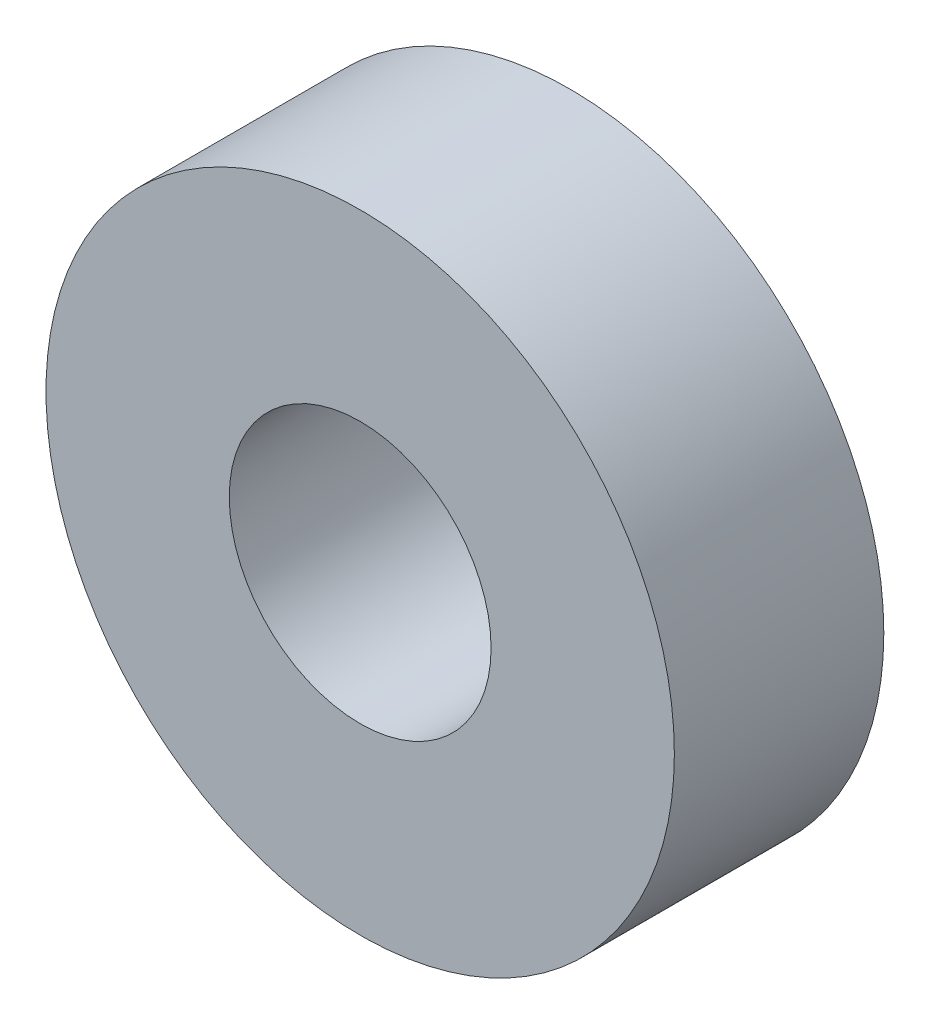
ISO-10303-21;
HEADER;
FILE_DESCRIPTION(('STEP AP214'),'2;1');
FILE_NAME('part.step','',(''),(''),'','','');
FILE_SCHEMA(('AUTOMOTIVE_DESIGN { 1 0 10303 214 1 1 1 1 }'));
ENDSEC;
DATA;
#1=APPLICATION_CONTEXT('core data for automotive mechanical design processes');
#2=APPLICATION_PROTOCOL_DEFINITION('international standard','automotive_design',2000,#1);
#3=PRODUCT_CONTEXT('',#1,'mechanical');
#4=PRODUCT('Part','Part','',(#3));
#5=PRODUCT_RELATED_PRODUCT_CATEGORY('part','',(#4));
#6=PRODUCT_DEFINITION_FORMATION('','',#4);
#7=PRODUCT_DEFINITION_CONTEXT('part definition',#1,'design');
#8=PRODUCT_DEFINITION('design','',#6,#7);
#9=PRODUCT_DEFINITION_SHAPE('','',#8);
#10=(LENGTH_UNIT() NAMED_UNIT(*) SI_UNIT(.MILLI.,.METRE.));
#11=(NAMED_UNIT(*) PLANE_ANGLE_UNIT() SI_UNIT($,.RADIAN.));
#12=(NAMED_UNIT(*) SI_UNIT($,.STERADIAN.) SOLID_ANGLE_UNIT());
#13=UNCERTAINTY_MEASURE_WITH_UNIT(LENGTH_MEASURE(1.E-05),#10,'distance_accuracy_value','');
#14=(GEOMETRIC_REPRESENTATION_CONTEXT(3) GLOBAL_UNCERTAINTY_ASSIGNED_CONTEXT((#13)) GLOBAL_UNIT_ASSIGNED_CONTEXT((#10,
#11,#12)) REPRESENTATION_CONTEXT('',''));
#15=CARTESIAN_POINT('',(0.,0.,0.));
#16=DIRECTION('',(0.,0.,1.));
#17=DIRECTION('',(1.,0.,0.));
#18=AXIS2_PLACEMENT_3D('',#15,#16,#17);
#19=CARTESIAN_POINT('',(0.,0.,2.));
#20=DIRECTION('',(0.,0.,1.));
#21=DIRECTION('',(1.,0.,0.));
#22=AXIS2_PLACEMENT_3D('',#19,#20,#21);
#23=PLANE('',#22);
#24=CARTESIAN_POINT('',(0.,0.,2.));
#25=DIRECTION('',(0.,0.,1.));
#26=DIRECTION('',(1.,0.,0.));
#27=AXIS2_PLACEMENT_3D('',#24,#25,#26);
#28=CIRCLE('',#27,6.);
#29=CARTESIAN_POINT('',(6.,0.,2.));
#30=VERTEX_POINT('',#29);
#31=EDGE_CURVE('E10',#30,#30,#28,.T.);
#32=ORIENTED_EDGE('',*,*,#31,.T.);
#33=EDGE_LOOP('',(#32));
#34=FACE_BOUND('',#33,.T.);
#35=CARTESIAN_POINT('',(0.,0.,2.));
#36=DIRECTION('',(0.,0.,1.));
#37=DIRECTION('',(1.,0.,0.));
#38=AXIS2_PLACEMENT_3D('',#35,#36,#37);
#39=CIRCLE('',#38,2.5);
#40=CARTESIAN_POINT('',(2.5,0.,2.));
#41=VERTEX_POINT('',#40);
#42=EDGE_CURVE('E42',#41,#41,#39,.T.);
#43=ORIENTED_EDGE('',*,*,#42,.F.);
#44=EDGE_LOOP('',(#43));
#45=FACE_BOUND('',#44,.T.);
#46=ADVANCED_FACE('F31',(#34,#45),#23,.T.);
#47=CARTESIAN_POINT('',(0.,0.,-2.));
#48=DIRECTION('',(0.,0.,1.));
#49=DIRECTION('',(1.,0.,0.));
#50=AXIS2_PLACEMENT_3D('',#47,#48,#49);
#51=PLANE('',#50);
#52=CARTESIAN_POINT('',(0.,0.,-2.));
#53=DIRECTION('',(0.,0.,1.));
#54=DIRECTION('',(1.,0.,0.));
#55=AXIS2_PLACEMENT_3D('',#52,#53,#54);
#56=CIRCLE('',#55,6.);
#57=CARTESIAN_POINT('',(6.,0.,-2.));
#58=VERTEX_POINT('',#57);
#59=EDGE_CURVE('E35',#58,#58,#56,.T.);
#60=ORIENTED_EDGE('',*,*,#59,.F.);
#61=EDGE_LOOP('',(#60));
#62=FACE_BOUND('',#61,.T.);
#63=CARTESIAN_POINT('',(0.,0.,-2.));
#64=DIRECTION('',(0.,0.,1.));
#65=DIRECTION('',(1.,0.,0.));
#66=AXIS2_PLACEMENT_3D('',#63,#64,#65);
#67=CIRCLE('',#66,2.5);
#68=CARTESIAN_POINT('',(2.5,0.,-2.));
#69=VERTEX_POINT('',#68);
#70=EDGE_CURVE('E44',#69,#69,#67,.T.);
#71=ORIENTED_EDGE('',*,*,#70,.T.);
#72=EDGE_LOOP('',(#71));
#73=FACE_BOUND('',#72,.T.);
#74=ADVANCED_FACE('F54',(#62,#73),#51,.F.);
#75=CARTESIAN_POINT('',(0.,0.,2.));
#76=DIRECTION('',(0.,0.,-1.));
#77=DIRECTION('',(-1.,0.,0.));
#78=AXIS2_PLACEMENT_3D('',#75,#76,#77);
#79=CYLINDRICAL_SURFACE('',#78,6.);
#80=ORIENTED_EDGE('',*,*,#31,.F.);
#81=EDGE_LOOP('',(#80));
#82=FACE_BOUND('',#81,.T.);
#83=ORIENTED_EDGE('',*,*,#59,.T.);
#84=EDGE_LOOP('',(#83));
#85=FACE_BOUND('',#84,.T.);
#86=ADVANCED_FACE('F33',(#82,#85),#79,.T.);
#87=CARTESIAN_POINT('',(0.,0.,2.));
#88=DIRECTION('',(0.,0.,-1.));
#89=DIRECTION('',(-1.,0.,0.));
#90=AXIS2_PLACEMENT_3D('',#87,#88,#89);
#91=CYLINDRICAL_SURFACE('',#90,2.5);
#92=ORIENTED_EDGE('',*,*,#42,.T.);
#93=EDGE_LOOP('',(#92));
#94=FACE_BOUND('',#93,.T.);
#95=ORIENTED_EDGE('',*,*,#70,.F.);
#96=EDGE_LOOP('',(#95));
#97=FACE_BOUND('',#96,.T.);
#98=ADVANCED_FACE('F50',(#94,#97),#91,.F.);
#99=CLOSED_SHELL('',(#46,#74,#86,#98));
#100=MANIFOLD_SOLID_BREP('B2',#99);
#101=ADVANCED_BREP_SHAPE_REPRESENTATION('',(#18,#100),#14);
#102=SHAPE_DEFINITION_REPRESENTATION(#9,#101);
ENDSEC;
END-ISO-10303-21;
